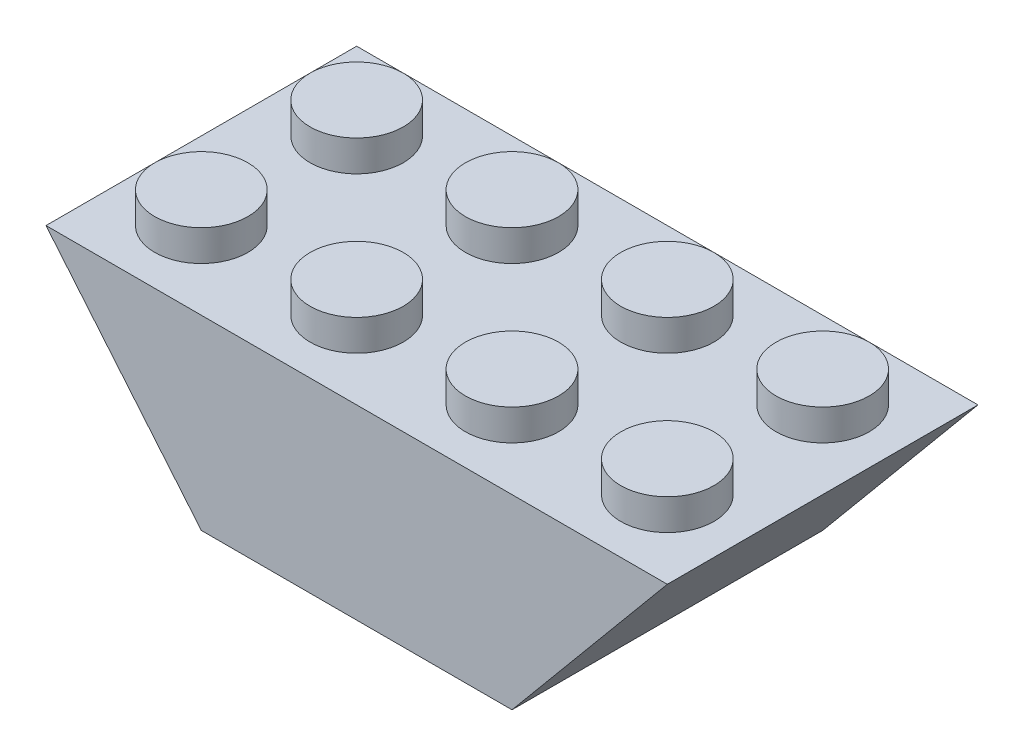
ISO-10303-21;
HEADER;
FILE_DESCRIPTION(('STEP AP214'),'2;1');
FILE_NAME('part.step','',(''),(''),'','','');
FILE_SCHEMA(('AUTOMOTIVE_DESIGN { 1 0 10303 214 1 1 1 1 }'));
ENDSEC;
DATA;
#1=APPLICATION_CONTEXT('core data for automotive mechanical design processes');
#2=APPLICATION_PROTOCOL_DEFINITION('international standard','automotive_design',2000,#1);
#3=PRODUCT_CONTEXT('',#1,'mechanical');
#4=PRODUCT('Part','Part','',(#3));
#5=PRODUCT_RELATED_PRODUCT_CATEGORY('part','',(#4));
#6=PRODUCT_DEFINITION_FORMATION('','',#4);
#7=PRODUCT_DEFINITION_CONTEXT('part definition',#1,'design');
#8=PRODUCT_DEFINITION('design','',#6,#7);
#9=PRODUCT_DEFINITION_SHAPE('','',#8);
#10=(LENGTH_UNIT() NAMED_UNIT(*) SI_UNIT(.MILLI.,.METRE.));
#11=(NAMED_UNIT(*) PLANE_ANGLE_UNIT() SI_UNIT($,.RADIAN.));
#12=(NAMED_UNIT(*) SI_UNIT($,.STERADIAN.) SOLID_ANGLE_UNIT());
#13=UNCERTAINTY_MEASURE_WITH_UNIT(LENGTH_MEASURE(1.E-05),#10,'distance_accuracy_value','');
#14=(GEOMETRIC_REPRESENTATION_CONTEXT(3) GLOBAL_UNCERTAINTY_ASSIGNED_CONTEXT((#13)) GLOBAL_UNIT_ASSIGNED_CONTEXT((#10,
#11,#12)) REPRESENTATION_CONTEXT('',''));
#15=CARTESIAN_POINT('',(0.,0.,0.));
#16=DIRECTION('',(0.,0.,1.));
#17=DIRECTION('',(1.,0.,0.));
#18=AXIS2_PLACEMENT_3D('',#15,#16,#17);
#19=CARTESIAN_POINT('',(-8.,0.,16.));
#20=DIRECTION('',(0.,1.,0.));
#21=DIRECTION('',(-1.,0.,0.));
#22=AXIS2_PLACEMENT_3D('',#19,#20,#21);
#23=PLANE('',#22);
#24=DIRECTION('',(1.,0.,0.));
#25=VECTOR('',#24,1.);
#26=CARTESIAN_POINT('',(-8.,0.,0.));
#27=LINE('',#26,#25);
#28=CARTESIAN_POINT('',(-8.,0.,0.));
#29=VERTEX_POINT('',#28);
#30=CARTESIAN_POINT('',(8.,0.,0.));
#31=VERTEX_POINT('',#30);
#32=EDGE_CURVE('E265',#29,#31,#27,.T.);
#33=ORIENTED_EDGE('',*,*,#32,.T.);
#34=DIRECTION('',(0.,0.,-1.));
#35=VECTOR('',#34,1.);
#36=CARTESIAN_POINT('',(8.,0.,16.));
#37=LINE('',#36,#35);
#38=CARTESIAN_POINT('',(8.,0.,16.));
#39=VERTEX_POINT('',#38);
#40=EDGE_CURVE('E278',#39,#31,#37,.T.);
#41=ORIENTED_EDGE('',*,*,#40,.F.);
#42=DIRECTION('',(1.,0.,0.));
#43=VECTOR('',#42,1.);
#44=CARTESIAN_POINT('',(-8.,0.,16.));
#45=LINE('',#44,#43);
#46=CARTESIAN_POINT('',(-8.,0.,16.));
#47=VERTEX_POINT('',#46);
#48=EDGE_CURVE('E93',#47,#39,#45,.T.);
#49=ORIENTED_EDGE('',*,*,#48,.F.);
#50=DIRECTION('',(0.,0.,-1.));
#51=VECTOR('',#50,1.);
#52=CARTESIAN_POINT('',(-8.,0.,16.));
#53=LINE('',#52,#51);
#54=EDGE_CURVE('E282',#47,#29,#53,.T.);
#55=ORIENTED_EDGE('',*,*,#54,.T.);
#56=EDGE_LOOP('',(#33,#41,#49,#55));
#57=FACE_BOUND('',#56,.T.);
#58=DIRECTION('',(1.,0.,0.));
#59=VECTOR('',#58,1.);
#60=CARTESIAN_POINT('',(-8.,0.,1.6));
#61=LINE('',#60,#59);
#62=CARTESIAN_POINT('',(-5.91726675309156,0.,1.6));
#63=VERTEX_POINT('',#62);
#64=CARTESIAN_POINT('',(5.91726675309156,0.,1.6));
#65=VERTEX_POINT('',#64);
#66=EDGE_CURVE('E169',#63,#65,#61,.T.);
#67=ORIENTED_EDGE('',*,*,#66,.F.);
#68=DIRECTION('',(0.,0.,-1.));
#69=VECTOR('',#68,1.);
#70=CARTESIAN_POINT('',(-5.91726675309156,0.,16.));
#71=LINE('',#70,#69);
#72=CARTESIAN_POINT('',(-5.91726675309156,0.,14.4));
#73=VERTEX_POINT('',#72);
#74=EDGE_CURVE('E167',#73,#63,#71,.T.);
#75=ORIENTED_EDGE('',*,*,#74,.F.);
#76=DIRECTION('',(1.,0.,0.));
#77=VECTOR('',#76,1.);
#78=CARTESIAN_POINT('',(-8.,0.,14.4));
#79=LINE('',#78,#77);
#80=CARTESIAN_POINT('',(5.91726675309156,0.,14.4));
#81=VERTEX_POINT('',#80);
#82=EDGE_CURVE('E184',#73,#81,#79,.T.);
#83=ORIENTED_EDGE('',*,*,#82,.T.);
#84=DIRECTION('',(0.,0.,-1.));
#85=VECTOR('',#84,1.);
#86=CARTESIAN_POINT('',(5.91726675309156,0.,16.));
#87=LINE('',#86,#85);
#88=EDGE_CURVE('E208',#81,#65,#87,.T.);
#89=ORIENTED_EDGE('',*,*,#88,.T.);
#90=EDGE_LOOP('',(#67,#75,#83,#89));
#91=FACE_BOUND('',#90,.T.);
#92=ADVANCED_FACE('F39',(#57,#91),#23,.F.);
#93=CARTESIAN_POINT('',(3.99999999999999,11.2,4.));
#94=DIRECTION('',(0.,1.,0.));
#95=DIRECTION('',(-1.,0.,0.));
#96=AXIS2_PLACEMENT_3D('',#93,#94,#95);
#97=PLANE('',#96);
#98=CARTESIAN_POINT('',(3.99999999999999,11.2,4.));
#99=DIRECTION('',(0.,1.,0.));
#100=DIRECTION('',(-1.,0.,0.));
#101=AXIS2_PLACEMENT_3D('',#98,#99,#100);
#102=CIRCLE('',#101,2.4);
#103=CARTESIAN_POINT('',(1.6,11.2,4.));
#104=VERTEX_POINT('',#103);
#105=EDGE_CURVE('E313',#104,#104,#102,.T.);
#106=ORIENTED_EDGE('',*,*,#105,.T.);
#107=EDGE_LOOP('',(#106));
#108=FACE_BOUND('',#107,.T.);
#109=ADVANCED_FACE('F41',(#108),#97,.T.);
#110=CARTESIAN_POINT('',(3.99999999999999,11.2,4.));
#111=DIRECTION('',(0.,-1.,0.));
#112=DIRECTION('',(1.,0.,0.));
#113=AXIS2_PLACEMENT_3D('',#110,#111,#112);
#114=CYLINDRICAL_SURFACE('',#113,2.4);
#115=ORIENTED_EDGE('',*,*,#105,.F.);
#116=EDGE_LOOP('',(#115));
#117=FACE_BOUND('',#116,.T.);
#118=CARTESIAN_POINT('',(3.99999999999999,9.6,4.));
#119=DIRECTION('',(0.,-1.,0.));
#120=DIRECTION('',(1.,0.,0.));
#121=AXIS2_PLACEMENT_3D('',#118,#119,#120);
#122=CIRCLE('',#121,2.4);
#123=CARTESIAN_POINT('',(6.39999999999999,9.6,4.));
#124=VERTEX_POINT('',#123);
#125=EDGE_CURVE('E309',#124,#124,#122,.F.);
#126=ORIENTED_EDGE('',*,*,#125,.T.);
#127=EDGE_LOOP('',(#126));
#128=FACE_BOUND('',#127,.T.);
#129=ADVANCED_FACE('F345',(#117,#128),#114,.T.);
#130=CARTESIAN_POINT('',(3.99999999999999,11.2,12.));
#131=DIRECTION('',(0.,1.,0.));
#132=DIRECTION('',(-1.,0.,0.));
#133=AXIS2_PLACEMENT_3D('',#130,#131,#132);
#134=PLANE('',#133);
#135=CARTESIAN_POINT('',(3.99999999999999,11.2,12.));
#136=DIRECTION('',(0.,1.,0.));
#137=DIRECTION('',(-1.,0.,0.));
#138=AXIS2_PLACEMENT_3D('',#135,#136,#137);
#139=CIRCLE('',#138,2.4);
#140=CARTESIAN_POINT('',(1.6,11.2,12.));
#141=VERTEX_POINT('',#140);
#142=EDGE_CURVE('E305',#141,#141,#139,.T.);
#143=ORIENTED_EDGE('',*,*,#142,.T.);
#144=EDGE_LOOP('',(#143));
#145=FACE_BOUND('',#144,.T.);
#146=ADVANCED_FACE('F347',(#145),#134,.T.);
#147=CARTESIAN_POINT('',(3.99999999999999,11.2,12.));
#148=DIRECTION('',(0.,-1.,0.));
#149=DIRECTION('',(1.,0.,0.));
#150=AXIS2_PLACEMENT_3D('',#147,#148,#149);
#151=CYLINDRICAL_SURFACE('',#150,2.4);
#152=ORIENTED_EDGE('',*,*,#142,.F.);
#153=EDGE_LOOP('',(#152));
#154=FACE_BOUND('',#153,.T.);
#155=CARTESIAN_POINT('',(3.99999999999999,9.6,12.));
#156=DIRECTION('',(0.,-1.,0.));
#157=DIRECTION('',(1.,0.,0.));
#158=AXIS2_PLACEMENT_3D('',#155,#156,#157);
#159=CIRCLE('',#158,2.4);
#160=CARTESIAN_POINT('',(6.39999999999999,9.6,12.));
#161=VERTEX_POINT('',#160);
#162=EDGE_CURVE('E301',#161,#161,#159,.F.);
#163=ORIENTED_EDGE('',*,*,#162,.T.);
#164=EDGE_LOOP('',(#163));
#165=FACE_BOUND('',#164,.T.);
#166=ADVANCED_FACE('F353',(#154,#165),#151,.T.);
#167=CARTESIAN_POINT('',(-4.00000000000001,11.2,4.));
#168=DIRECTION('',(0.,1.,0.));
#169=DIRECTION('',(-1.,0.,0.));
#170=AXIS2_PLACEMENT_3D('',#167,#168,#169);
#171=PLANE('',#170);
#172=CARTESIAN_POINT('',(-4.00000000000001,11.2,4.));
#173=DIRECTION('',(0.,1.,0.));
#174=DIRECTION('',(-1.,0.,0.));
#175=AXIS2_PLACEMENT_3D('',#172,#173,#174);
#176=CIRCLE('',#175,2.4);
#177=CARTESIAN_POINT('',(-6.4,11.2,4.));
#178=VERTEX_POINT('',#177);
#179=EDGE_CURVE('E297',#178,#178,#176,.T.);
#180=ORIENTED_EDGE('',*,*,#179,.T.);
#181=EDGE_LOOP('',(#180));
#182=FACE_BOUND('',#181,.T.);
#183=ADVANCED_FACE('F372',(#182),#171,.T.);
#184=CARTESIAN_POINT('',(-4.00000000000001,11.2,4.));
#185=DIRECTION('',(0.,-1.,0.));
#186=DIRECTION('',(1.,0.,0.));
#187=AXIS2_PLACEMENT_3D('',#184,#185,#186);
#188=CYLINDRICAL_SURFACE('',#187,2.4);
#189=ORIENTED_EDGE('',*,*,#179,.F.);
#190=EDGE_LOOP('',(#189));
#191=FACE_BOUND('',#190,.T.);
#192=CARTESIAN_POINT('',(-4.00000000000001,9.6,4.));
#193=DIRECTION('',(0.,-1.,0.));
#194=DIRECTION('',(1.,0.,0.));
#195=AXIS2_PLACEMENT_3D('',#192,#193,#194);
#196=CIRCLE('',#195,2.4);
#197=CARTESIAN_POINT('',(-1.60000000000001,9.6,4.));
#198=VERTEX_POINT('',#197);
#199=EDGE_CURVE('E293',#198,#198,#196,.F.);
#200=ORIENTED_EDGE('',*,*,#199,.T.);
#201=EDGE_LOOP('',(#200));
#202=FACE_BOUND('',#201,.T.);
#203=ADVANCED_FACE('F368',(#191,#202),#188,.T.);
#204=CARTESIAN_POINT('',(-16.,9.59999999999999,16.));
#205=DIRECTION('',(0.768221279597376,0.64018439966448,0.));
#206=DIRECTION('',(-0.64018439966448,0.768221279597376,0.));
#207=AXIS2_PLACEMENT_3D('',#204,#205,#206);
#208=PLANE('',#207);
#209=DIRECTION('',(0.64018439966448,-0.768221279597376,0.));
#210=VECTOR('',#209,1.);
#211=CARTESIAN_POINT('',(-16.,9.59999999999999,0.));
#212=LINE('',#211,#210);
#213=CARTESIAN_POINT('',(-16.,9.59999999999999,0.));
#214=VERTEX_POINT('',#213);
#215=EDGE_CURVE('E250',#214,#29,#212,.T.);
#216=ORIENTED_EDGE('',*,*,#215,.T.);
#217=ORIENTED_EDGE('',*,*,#54,.F.);
#218=DIRECTION('',(0.64018439966448,-0.768221279597376,0.));
#219=VECTOR('',#218,1.);
#220=CARTESIAN_POINT('',(-16.,9.59999999999999,16.));
#221=LINE('',#220,#219);
#222=CARTESIAN_POINT('',(-16.,9.59999999999999,16.));
#223=VERTEX_POINT('',#222);
#224=EDGE_CURVE('E251',#223,#47,#221,.T.);
#225=ORIENTED_EDGE('',*,*,#224,.F.);
#226=DIRECTION('',(0.,0.,-1.));
#227=VECTOR('',#226,1.);
#228=CARTESIAN_POINT('',(-16.,9.59999999999999,16.));
#229=LINE('',#228,#227);
#230=EDGE_CURVE('E261',#223,#214,#229,.T.);
#231=ORIENTED_EDGE('',*,*,#230,.T.);
#232=EDGE_LOOP('',(#216,#217,#225,#231));
#233=FACE_BOUND('',#232,.T.);
#234=ADVANCED_FACE('F365',(#233),#208,.F.);
#235=CARTESIAN_POINT('',(8.,0.,16.));
#236=DIRECTION('',(-0.768221279597376,0.64018439966448,0.));
#237=DIRECTION('',(-0.64018439966448,-0.768221279597376,0.));
#238=AXIS2_PLACEMENT_3D('',#235,#236,#237);
#239=PLANE('',#238);
#240=DIRECTION('',(0.64018439966448,0.768221279597376,0.));
#241=VECTOR('',#240,1.);
#242=CARTESIAN_POINT('',(8.,0.,0.));
#243=LINE('',#242,#241);
#244=CARTESIAN_POINT('',(16.,9.6,0.));
#245=VERTEX_POINT('',#244);
#246=EDGE_CURVE('E268',#31,#245,#243,.T.);
#247=ORIENTED_EDGE('',*,*,#246,.T.);
#248=DIRECTION('',(0.,0.,-1.));
#249=VECTOR('',#248,1.);
#250=CARTESIAN_POINT('',(16.,9.6,16.));
#251=LINE('',#250,#249);
#252=CARTESIAN_POINT('',(16.,9.6,16.));
#253=VERTEX_POINT('',#252);
#254=EDGE_CURVE('E275',#253,#245,#251,.T.);
#255=ORIENTED_EDGE('',*,*,#254,.F.);
#256=DIRECTION('',(0.64018439966448,0.768221279597376,0.));
#257=VECTOR('',#256,1.);
#258=CARTESIAN_POINT('',(8.,0.,16.));
#259=LINE('',#258,#257);
#260=EDGE_CURVE('E256',#39,#253,#259,.T.);
#261=ORIENTED_EDGE('',*,*,#260,.F.);
#262=ORIENTED_EDGE('',*,*,#40,.T.);
#263=EDGE_LOOP('',(#247,#255,#261,#262));
#264=FACE_BOUND('',#263,.T.);
#265=ADVANCED_FACE('F330',(#264),#239,.F.);
#266=CARTESIAN_POINT('',(16.,9.6,16.));
#267=DIRECTION('',(0.,-1.,0.));
#268=DIRECTION('',(1.,0.,0.));
#269=AXIS2_PLACEMENT_3D('',#266,#267,#268);
#270=PLANE('',#269);
#271=CARTESIAN_POINT('',(12.,9.6,4.));
#272=DIRECTION('',(0.,-1.,0.));
#273=DIRECTION('',(1.,0.,0.));
#274=AXIS2_PLACEMENT_3D('',#271,#272,#273);
#275=CIRCLE('',#274,2.4);
#276=CARTESIAN_POINT('',(14.4,9.6,4.));
#277=VERTEX_POINT('',#276);
#278=EDGE_CURVE('E11',#277,#277,#275,.F.);
#279=ORIENTED_EDGE('',*,*,#278,.F.);
#280=EDGE_LOOP('',(#279));
#281=FACE_BOUND('',#280,.T.);
#282=CARTESIAN_POINT('',(-12.,9.59999999999999,4.));
#283=DIRECTION('',(0.,-1.,0.));
#284=DIRECTION('',(1.,0.,0.));
#285=AXIS2_PLACEMENT_3D('',#282,#283,#284);
#286=CIRCLE('',#285,2.4);
#287=CARTESIAN_POINT('',(-9.60000000000001,9.59999999999999,4.));
#288=VERTEX_POINT('',#287);
#289=EDGE_CURVE('E48',#288,#288,#286,.F.);
#290=ORIENTED_EDGE('',*,*,#289,.F.);
#291=EDGE_LOOP('',(#290));
#292=FACE_BOUND('',#291,.T.);
#293=CARTESIAN_POINT('',(12.,9.6,12.));
#294=DIRECTION('',(0.,-1.,0.));
#295=DIRECTION('',(1.,0.,0.));
#296=AXIS2_PLACEMENT_3D('',#293,#294,#295);
#297=CIRCLE('',#296,2.4);
#298=CARTESIAN_POINT('',(14.4,9.6,12.));
#299=VERTEX_POINT('',#298);
#300=EDGE_CURVE('E317',#299,#299,#297,.F.);
#301=ORIENTED_EDGE('',*,*,#300,.F.);
#302=EDGE_LOOP('',(#301));
#303=FACE_BOUND('',#302,.T.);
#304=CARTESIAN_POINT('',(-4.00000000000001,9.6,12.));
#305=DIRECTION('',(0.,-1.,0.));
#306=DIRECTION('',(1.,0.,0.));
#307=AXIS2_PLACEMENT_3D('',#304,#305,#306);
#308=CIRCLE('',#307,2.4);
#309=CARTESIAN_POINT('',(-1.60000000000001,9.6,12.));
#310=VERTEX_POINT('',#309);
#311=EDGE_CURVE('E289',#310,#310,#308,.F.);
#312=ORIENTED_EDGE('',*,*,#311,.F.);
#313=EDGE_LOOP('',(#312));
#314=FACE_BOUND('',#313,.T.);
#315=CARTESIAN_POINT('',(-12.,9.59999999999999,12.));
#316=DIRECTION('',(0.,-1.,0.));
#317=DIRECTION('',(1.,0.,0.));
#318=AXIS2_PLACEMENT_3D('',#315,#316,#317);
#319=CIRCLE('',#318,2.4);
#320=CARTESIAN_POINT('',(-9.60000000000001,9.59999999999999,12.));
#321=VERTEX_POINT('',#320);
#322=EDGE_CURVE('E285',#321,#321,#319,.F.);
#323=ORIENTED_EDGE('',*,*,#322,.F.);
#324=EDGE_LOOP('',(#323));
#325=FACE_BOUND('',#324,.T.);
#326=DIRECTION('',(-1.,0.,0.));
#327=VECTOR('',#326,1.);
#328=CARTESIAN_POINT('',(16.,9.6,0.));
#329=LINE('',#328,#327);
#330=EDGE_CURVE('E85',#245,#214,#329,.T.);
#331=ORIENTED_EDGE('',*,*,#330,.T.);
#332=ORIENTED_EDGE('',*,*,#230,.F.);
#333=DIRECTION('',(-1.,0.,0.));
#334=VECTOR('',#333,1.);
#335=CARTESIAN_POINT('',(16.,9.6,16.));
#336=LINE('',#335,#334);
#337=EDGE_CURVE('E64',#253,#223,#336,.T.);
#338=ORIENTED_EDGE('',*,*,#337,.F.);
#339=ORIENTED_EDGE('',*,*,#254,.T.);
#340=EDGE_LOOP('',(#331,#332,#338,#339));
#341=FACE_BOUND('',#340,.T.);
#342=ORIENTED_EDGE('',*,*,#199,.F.);
#343=EDGE_LOOP('',(#342));
#344=FACE_BOUND('',#343,.T.);
#345=ORIENTED_EDGE('',*,*,#162,.F.);
#346=EDGE_LOOP('',(#345));
#347=FACE_BOUND('',#346,.T.);
#348=ORIENTED_EDGE('',*,*,#125,.F.);
#349=EDGE_LOOP('',(#348));
#350=FACE_BOUND('',#349,.T.);
#351=ADVANCED_FACE('F326',(#281,#292,#303,#314,#325,#341,#344,#347,#350),#270,.F.);
#352=CARTESIAN_POINT('',(0.,0.,16.));
#353=DIRECTION('',(0.,0.,1.));
#354=DIRECTION('',(1.,0.,0.));
#355=AXIS2_PLACEMENT_3D('',#352,#353,#354);
#356=PLANE('',#355);
#357=ORIENTED_EDGE('',*,*,#224,.T.);
#358=ORIENTED_EDGE('',*,*,#48,.T.);
#359=ORIENTED_EDGE('',*,*,#260,.T.);
#360=ORIENTED_EDGE('',*,*,#337,.T.);
#361=EDGE_LOOP('',(#357,#358,#359,#360));
#362=FACE_BOUND('',#361,.T.);
#363=ADVANCED_FACE('F329',(#362),#356,.T.);
#364=CARTESIAN_POINT('',(0.,0.,0.));
#365=DIRECTION('',(0.,0.,1.));
#366=DIRECTION('',(1.,0.,0.));
#367=AXIS2_PLACEMENT_3D('',#364,#365,#366);
#368=PLANE('',#367);
#369=ORIENTED_EDGE('',*,*,#215,.F.);
#370=ORIENTED_EDGE('',*,*,#330,.F.);
#371=ORIENTED_EDGE('',*,*,#246,.F.);
#372=ORIENTED_EDGE('',*,*,#32,.F.);
#373=EDGE_LOOP('',(#369,#370,#371,#372));
#374=FACE_BOUND('',#373,.T.);
#375=ADVANCED_FACE('F414',(#374),#368,.F.);
#376=CARTESIAN_POINT('',(-12.,11.2,12.));
#377=DIRECTION('',(0.,-1.,0.));
#378=DIRECTION('',(1.,0.,0.));
#379=AXIS2_PLACEMENT_3D('',#376,#377,#378);
#380=CYLINDRICAL_SURFACE('',#379,2.4);
#381=CARTESIAN_POINT('',(-12.,11.2,12.));
#382=DIRECTION('',(0.,1.,0.));
#383=DIRECTION('',(-1.,0.,0.));
#384=AXIS2_PLACEMENT_3D('',#381,#382,#383);
#385=CIRCLE('',#384,2.4);
#386=CARTESIAN_POINT('',(-14.4,11.2,12.));
#387=VERTEX_POINT('',#386);
#388=EDGE_CURVE('E246',#387,#387,#385,.T.);
#389=ORIENTED_EDGE('',*,*,#388,.F.);
#390=EDGE_LOOP('',(#389));
#391=FACE_BOUND('',#390,.T.);
#392=ORIENTED_EDGE('',*,*,#322,.T.);
#393=EDGE_LOOP('',(#392));
#394=FACE_BOUND('',#393,.T.);
#395=ADVANCED_FACE('F421',(#391,#394),#380,.T.);
#396=CARTESIAN_POINT('',(-12.,11.2,12.));
#397=DIRECTION('',(0.,1.,0.));
#398=DIRECTION('',(-1.,0.,0.));
#399=AXIS2_PLACEMENT_3D('',#396,#397,#398);
#400=PLANE('',#399);
#401=ORIENTED_EDGE('',*,*,#388,.T.);
#402=EDGE_LOOP('',(#401));
#403=FACE_BOUND('',#402,.T.);
#404=ADVANCED_FACE('F429',(#403),#400,.T.);
#405=CARTESIAN_POINT('',(-4.00000000000001,11.2,12.));
#406=DIRECTION('',(0.,-1.,0.));
#407=DIRECTION('',(1.,0.,0.));
#408=AXIS2_PLACEMENT_3D('',#405,#406,#407);
#409=CYLINDRICAL_SURFACE('',#408,2.4);
#410=CARTESIAN_POINT('',(-4.00000000000001,11.2,12.));
#411=DIRECTION('',(0.,1.,0.));
#412=DIRECTION('',(-1.,0.,0.));
#413=AXIS2_PLACEMENT_3D('',#410,#411,#412);
#414=CIRCLE('',#413,2.4);
#415=CARTESIAN_POINT('',(-6.4,11.2,12.));
#416=VERTEX_POINT('',#415);
#417=EDGE_CURVE('E242',#416,#416,#414,.T.);
#418=ORIENTED_EDGE('',*,*,#417,.F.);
#419=EDGE_LOOP('',(#418));
#420=FACE_BOUND('',#419,.T.);
#421=ORIENTED_EDGE('',*,*,#311,.T.);
#422=EDGE_LOOP('',(#421));
#423=FACE_BOUND('',#422,.T.);
#424=ADVANCED_FACE('F437',(#420,#423),#409,.T.);
#425=CARTESIAN_POINT('',(-4.00000000000001,11.2,12.));
#426=DIRECTION('',(0.,1.,0.));
#427=DIRECTION('',(-1.,0.,0.));
#428=AXIS2_PLACEMENT_3D('',#425,#426,#427);
#429=PLANE('',#428);
#430=ORIENTED_EDGE('',*,*,#417,.T.);
#431=EDGE_LOOP('',(#430));
#432=FACE_BOUND('',#431,.T.);
#433=ADVANCED_FACE('F445',(#432),#429,.T.);
#434=CARTESIAN_POINT('',(12.,11.2,12.));
#435=DIRECTION('',(0.,-1.,0.));
#436=DIRECTION('',(1.,0.,0.));
#437=AXIS2_PLACEMENT_3D('',#434,#435,#436);
#438=CYLINDRICAL_SURFACE('',#437,2.4);
#439=CARTESIAN_POINT('',(12.,11.2,12.));
#440=DIRECTION('',(0.,1.,0.));
#441=DIRECTION('',(-1.,0.,0.));
#442=AXIS2_PLACEMENT_3D('',#439,#440,#441);
#443=CIRCLE('',#442,2.4);
#444=CARTESIAN_POINT('',(9.6,11.2,12.));
#445=VERTEX_POINT('',#444);
#446=EDGE_CURVE('E238',#445,#445,#443,.T.);
#447=ORIENTED_EDGE('',*,*,#446,.F.);
#448=EDGE_LOOP('',(#447));
#449=FACE_BOUND('',#448,.T.);
#450=ORIENTED_EDGE('',*,*,#300,.T.);
#451=EDGE_LOOP('',(#450));
#452=FACE_BOUND('',#451,.T.);
#453=ADVANCED_FACE('F453',(#449,#452),#438,.T.);
#454=CARTESIAN_POINT('',(12.,11.2,12.));
#455=DIRECTION('',(0.,1.,0.));
#456=DIRECTION('',(-1.,0.,0.));
#457=AXIS2_PLACEMENT_3D('',#454,#455,#456);
#458=PLANE('',#457);
#459=ORIENTED_EDGE('',*,*,#446,.T.);
#460=EDGE_LOOP('',(#459));
#461=FACE_BOUND('',#460,.T.);
#462=ADVANCED_FACE('F461',(#461),#458,.T.);
#463=CARTESIAN_POINT('',(-12.,11.2,4.));
#464=DIRECTION('',(0.,-1.,0.));
#465=DIRECTION('',(1.,0.,0.));
#466=AXIS2_PLACEMENT_3D('',#463,#464,#465);
#467=CYLINDRICAL_SURFACE('',#466,2.4);
#468=CARTESIAN_POINT('',(-12.,11.2,4.));
#469=DIRECTION('',(0.,1.,0.));
#470=DIRECTION('',(-1.,0.,0.));
#471=AXIS2_PLACEMENT_3D('',#468,#469,#470);
#472=CIRCLE('',#471,2.4);
#473=CARTESIAN_POINT('',(-14.4,11.2,4.));
#474=VERTEX_POINT('',#473);
#475=EDGE_CURVE('E234',#474,#474,#472,.T.);
#476=ORIENTED_EDGE('',*,*,#475,.F.);
#477=EDGE_LOOP('',(#476));
#478=FACE_BOUND('',#477,.T.);
#479=ORIENTED_EDGE('',*,*,#289,.T.);
#480=EDGE_LOOP('',(#479));
#481=FACE_BOUND('',#480,.T.);
#482=ADVANCED_FACE('F324',(#478,#481),#467,.T.);
#483=CARTESIAN_POINT('',(-12.,11.2,4.));
#484=DIRECTION('',(0.,1.,0.));
#485=DIRECTION('',(-1.,0.,0.));
#486=AXIS2_PLACEMENT_3D('',#483,#484,#485);
#487=PLANE('',#486);
#488=ORIENTED_EDGE('',*,*,#475,.T.);
#489=EDGE_LOOP('',(#488));
#490=FACE_BOUND('',#489,.T.);
#491=ADVANCED_FACE('F476',(#490),#487,.T.);
#492=CARTESIAN_POINT('',(12.,11.2,4.));
#493=DIRECTION('',(0.,-1.,0.));
#494=DIRECTION('',(1.,0.,0.));
#495=AXIS2_PLACEMENT_3D('',#492,#493,#494);
#496=CYLINDRICAL_SURFACE('',#495,2.4);
#497=CARTESIAN_POINT('',(12.,11.2,4.));
#498=DIRECTION('',(0.,1.,0.));
#499=DIRECTION('',(-1.,0.,0.));
#500=AXIS2_PLACEMENT_3D('',#497,#498,#499);
#501=CIRCLE('',#500,2.4);
#502=CARTESIAN_POINT('',(9.6,11.2,4.));
#503=VERTEX_POINT('',#502);
#504=EDGE_CURVE('E230',#503,#503,#501,.T.);
#505=ORIENTED_EDGE('',*,*,#504,.F.);
#506=EDGE_LOOP('',(#505));
#507=FACE_BOUND('',#506,.T.);
#508=ORIENTED_EDGE('',*,*,#278,.T.);
#509=EDGE_LOOP('',(#508));
#510=FACE_BOUND('',#509,.T.);
#511=ADVANCED_FACE('F484',(#507,#510),#496,.T.);
#512=CARTESIAN_POINT('',(12.,11.2,4.));
#513=DIRECTION('',(0.,1.,0.));
#514=DIRECTION('',(-1.,0.,0.));
#515=AXIS2_PLACEMENT_3D('',#512,#513,#514);
#516=PLANE('',#515);
#517=ORIENTED_EDGE('',*,*,#504,.T.);
#518=EDGE_LOOP('',(#517));
#519=FACE_BOUND('',#518,.T.);
#520=ADVANCED_FACE('F492',(#519),#516,.T.);
#521=CARTESIAN_POINT('',(3.99999999999999,9.6,4.));
#522=DIRECTION('',(0.,1.,0.));
#523=DIRECTION('',(-1.,0.,0.));
#524=AXIS2_PLACEMENT_3D('',#521,#522,#523);
#525=PLANE('',#524);
#526=CARTESIAN_POINT('',(3.99999999999999,9.6,4.));
#527=DIRECTION('',(0.,1.,0.));
#528=DIRECTION('',(-1.,0.,0.));
#529=AXIS2_PLACEMENT_3D('',#526,#527,#528);
#530=CIRCLE('',#529,0.799999999999999);
#531=CARTESIAN_POINT('',(3.2,9.6,4.));
#532=VERTEX_POINT('',#531);
#533=EDGE_CURVE('E779',#532,#532,#530,.T.);
#534=ORIENTED_EDGE('',*,*,#533,.F.);
#535=EDGE_LOOP('',(#534));
#536=FACE_BOUND('',#535,.T.);
#537=ADVANCED_FACE('F500',(#536),#525,.F.);
#538=CARTESIAN_POINT('',(3.99999999999999,11.2,4.));
#539=DIRECTION('',(0.,-1.,0.));
#540=DIRECTION('',(1.,0.,0.));
#541=AXIS2_PLACEMENT_3D('',#538,#539,#540);
#542=CYLINDRICAL_SURFACE('',#541,0.799999999999999);
#543=ORIENTED_EDGE('',*,*,#533,.T.);
#544=EDGE_LOOP('',(#543));
#545=FACE_BOUND('',#544,.T.);
#546=CARTESIAN_POINT('',(4.,8.,4.));
#547=DIRECTION('',(0.,-1.,0.));
#548=DIRECTION('',(1.,0.,0.));
#549=AXIS2_PLACEMENT_3D('',#546,#547,#548);
#550=CIRCLE('',#549,0.799999999999999);
#551=CARTESIAN_POINT('',(4.79999999999999,8.,4.));
#552=VERTEX_POINT('',#551);
#553=EDGE_CURVE('E773',#552,#552,#550,.F.);
#554=ORIENTED_EDGE('',*,*,#553,.F.);
#555=EDGE_LOOP('',(#554));
#556=FACE_BOUND('',#555,.T.);
#557=ADVANCED_FACE('F508',(#545,#556),#542,.F.);
#558=CARTESIAN_POINT('',(3.99999999999999,9.6,12.));
#559=DIRECTION('',(0.,1.,0.));
#560=DIRECTION('',(-1.,0.,0.));
#561=AXIS2_PLACEMENT_3D('',#558,#559,#560);
#562=PLANE('',#561);
#563=CARTESIAN_POINT('',(3.99999999999999,9.6,12.));
#564=DIRECTION('',(0.,1.,0.));
#565=DIRECTION('',(-1.,0.,0.));
#566=AXIS2_PLACEMENT_3D('',#563,#564,#565);
#567=CIRCLE('',#566,0.799999999999999);
#568=CARTESIAN_POINT('',(3.2,9.6,12.));
#569=VERTEX_POINT('',#568);
#570=EDGE_CURVE('E801',#569,#569,#567,.T.);
#571=ORIENTED_EDGE('',*,*,#570,.F.);
#572=EDGE_LOOP('',(#571));
#573=FACE_BOUND('',#572,.T.);
#574=ADVANCED_FACE('F516',(#573),#562,.F.);
#575=CARTESIAN_POINT('',(3.99999999999999,11.2,12.));
#576=DIRECTION('',(0.,-1.,0.));
#577=DIRECTION('',(1.,0.,0.));
#578=AXIS2_PLACEMENT_3D('',#575,#576,#577);
#579=CYLINDRICAL_SURFACE('',#578,0.799999999999999);
#580=ORIENTED_EDGE('',*,*,#570,.T.);
#581=EDGE_LOOP('',(#580));
#582=FACE_BOUND('',#581,.T.);
#583=CARTESIAN_POINT('',(4.,8.,12.));
#584=DIRECTION('',(0.,-1.,0.));
#585=DIRECTION('',(1.,0.,0.));
#586=AXIS2_PLACEMENT_3D('',#583,#584,#585);
#587=CIRCLE('',#586,0.799999999999999);
#588=CARTESIAN_POINT('',(4.79999999999999,8.,12.));
#589=VERTEX_POINT('',#588);
#590=EDGE_CURVE('E798',#589,#589,#587,.F.);
#591=ORIENTED_EDGE('',*,*,#590,.F.);
#592=EDGE_LOOP('',(#591));
#593=FACE_BOUND('',#592,.T.);
#594=ADVANCED_FACE('F524',(#582,#593),#579,.F.);
#595=CARTESIAN_POINT('',(-4.00000000000001,9.6,4.));
#596=DIRECTION('',(0.,1.,0.));
#597=DIRECTION('',(-1.,0.,0.));
#598=AXIS2_PLACEMENT_3D('',#595,#596,#597);
#599=PLANE('',#598);
#600=CARTESIAN_POINT('',(-4.00000000000001,9.6,4.));
#601=DIRECTION('',(0.,1.,0.));
#602=DIRECTION('',(-1.,0.,0.));
#603=AXIS2_PLACEMENT_3D('',#600,#601,#602);
#604=CIRCLE('',#603,0.799999999999999);
#605=CARTESIAN_POINT('',(-4.8,9.6,4.));
#606=VERTEX_POINT('',#605);
#607=EDGE_CURVE('E180',#606,#606,#604,.T.);
#608=ORIENTED_EDGE('',*,*,#607,.F.);
#609=EDGE_LOOP('',(#608));
#610=FACE_BOUND('',#609,.T.);
#611=ADVANCED_FACE('F532',(#610),#599,.F.);
#612=CARTESIAN_POINT('',(-4.00000000000001,11.2,4.));
#613=DIRECTION('',(0.,-1.,0.));
#614=DIRECTION('',(1.,0.,0.));
#615=AXIS2_PLACEMENT_3D('',#612,#613,#614);
#616=CYLINDRICAL_SURFACE('',#615,0.799999999999999);
#617=ORIENTED_EDGE('',*,*,#607,.T.);
#618=EDGE_LOOP('',(#617));
#619=FACE_BOUND('',#618,.T.);
#620=CARTESIAN_POINT('',(-4.,7.99999999999999,4.));
#621=DIRECTION('',(0.,-1.,0.));
#622=DIRECTION('',(1.,0.,0.));
#623=AXIS2_PLACEMENT_3D('',#620,#621,#622);
#624=CIRCLE('',#623,0.799999999999999);
#625=CARTESIAN_POINT('',(-3.20000000000001,7.99999999999999,4.));
#626=VERTEX_POINT('',#625);
#627=EDGE_CURVE('E784',#626,#626,#624,.F.);
#628=ORIENTED_EDGE('',*,*,#627,.F.);
#629=EDGE_LOOP('',(#628));
#630=FACE_BOUND('',#629,.T.);
#631=ADVANCED_FACE('F540',(#619,#630),#616,.F.);
#632=CARTESIAN_POINT('',(-14.7708459526442,10.6242950394632,16.));
#633=DIRECTION('',(0.768221279597376,0.64018439966448,0.));
#634=DIRECTION('',(-0.64018439966448,0.768221279597376,0.));
#635=AXIS2_PLACEMENT_3D('',#632,#633,#634);
#636=PLANE('',#635);
#637=DIRECTION('',(0.64018439966448,-0.768221279597376,0.));
#638=VECTOR('',#637,1.);
#639=CARTESIAN_POINT('',(-14.7708459526442,10.6242950394632,1.6));
#640=LINE('',#639,#638);
#641=CARTESIAN_POINT('',(-12.5839334197582,7.99999999999999,1.6));
#642=VERTEX_POINT('',#641);
#643=EDGE_CURVE('E144',#642,#63,#640,.T.);
#644=ORIENTED_EDGE('',*,*,#643,.F.);
#645=DIRECTION('',(0.,0.,-1.));
#646=VECTOR('',#645,1.);
#647=CARTESIAN_POINT('',(-12.5839334197582,7.99999999999999,16.));
#648=LINE('',#647,#646);
#649=CARTESIAN_POINT('',(-12.5839334197582,7.99999999999999,3.45317117734206));
#650=VERTEX_POINT('',#649);
#651=EDGE_CURVE('E154',#650,#642,#648,.T.);
#652=ORIENTED_EDGE('',*,*,#651,.F.);
#653=CARTESIAN_POINT('',(-12.,7.29927989629013,4.));
#654=DIRECTION('',(0.768221279597376,0.64018439966448,0.));
#655=DIRECTION('',(0.64018439966448,-0.768221279597376,0.));
#656=AXIS2_PLACEMENT_3D('',#653,#654,#655);
#657=ELLIPSE('',#656,1.24963994814506,0.799999999999999);
#658=CARTESIAN_POINT('',(-12.5839334197582,7.99999999999999,4.54682882265794));
#659=VERTEX_POINT('',#658);
#660=EDGE_CURVE('E224',#650,#659,#657,.T.);
#661=ORIENTED_EDGE('',*,*,#660,.T.);
#662=CARTESIAN_POINT('',(-12.5839334197582,7.99999999999999,11.4531711773421));
#663=VERTEX_POINT('',#662);
#664=EDGE_CURVE('E162',#663,#659,#648,.T.);
#665=ORIENTED_EDGE('',*,*,#664,.F.);
#666=CARTESIAN_POINT('',(-12.,7.29927989629013,12.));
#667=DIRECTION('',(0.768221279597376,0.64018439966448,0.));
#668=DIRECTION('',(0.64018439966448,-0.768221279597376,0.));
#669=AXIS2_PLACEMENT_3D('',#666,#667,#668);
#670=ELLIPSE('',#669,1.24963994814506,0.799999999999999);
#671=CARTESIAN_POINT('',(-12.5839334197582,7.99999999999999,12.5468288226579));
#672=VERTEX_POINT('',#671);
#673=EDGE_CURVE('E217',#663,#672,#670,.T.);
#674=ORIENTED_EDGE('',*,*,#673,.T.);
#675=CARTESIAN_POINT('',(-12.5839334197582,7.99999999999999,14.4));
#676=VERTEX_POINT('',#675);
#677=EDGE_CURVE('E164',#676,#672,#648,.T.);
#678=ORIENTED_EDGE('',*,*,#677,.F.);
#679=DIRECTION('',(0.64018439966448,-0.768221279597376,0.));
#680=VECTOR('',#679,1.);
#681=CARTESIAN_POINT('',(-14.7708459526442,10.6242950394632,14.4));
#682=LINE('',#681,#680);
#683=EDGE_CURVE('E55',#676,#73,#682,.T.);
#684=ORIENTED_EDGE('',*,*,#683,.T.);
#685=ORIENTED_EDGE('',*,*,#74,.T.);
#686=EDGE_LOOP('',(#644,#652,#661,#665,#674,#678,#684,#685));
#687=FACE_BOUND('',#686,.T.);
#688=ADVANCED_FACE('F165',(#687),#636,.T.);
#689=CARTESIAN_POINT('',(6.7708459526442,1.02429503946317,16.));
#690=DIRECTION('',(-0.768221279597376,0.64018439966448,0.));
#691=DIRECTION('',(-0.64018439966448,-0.768221279597376,0.));
#692=AXIS2_PLACEMENT_3D('',#689,#690,#691);
#693=PLANE('',#692);
#694=DIRECTION('',(0.64018439966448,0.768221279597376,0.));
#695=VECTOR('',#694,1.);
#696=CARTESIAN_POINT('',(6.7708459526442,1.02429503946317,1.6));
#697=LINE('',#696,#695);
#698=CARTESIAN_POINT('',(12.5839334197582,8.,1.6));
#699=VERTEX_POINT('',#698);
#700=EDGE_CURVE('E147',#65,#699,#697,.T.);
#701=ORIENTED_EDGE('',*,*,#700,.F.);
#702=ORIENTED_EDGE('',*,*,#88,.F.);
#703=DIRECTION('',(0.64018439966448,0.768221279597376,0.));
#704=VECTOR('',#703,1.);
#705=CARTESIAN_POINT('',(6.7708459526442,1.02429503946317,14.4));
#706=LINE('',#705,#704);
#707=CARTESIAN_POINT('',(12.5839334197582,8.,14.4));
#708=VERTEX_POINT('',#707);
#709=EDGE_CURVE('E185',#81,#708,#706,.T.);
#710=ORIENTED_EDGE('',*,*,#709,.T.);
#711=DIRECTION('',(0.,0.,-1.));
#712=VECTOR('',#711,1.);
#713=CARTESIAN_POINT('',(12.5839334197582,8.,16.));
#714=LINE('',#713,#712);
#715=CARTESIAN_POINT('',(12.5839334197582,8.,12.5468288226579));
#716=VERTEX_POINT('',#715);
#717=EDGE_CURVE('E213',#708,#716,#714,.T.);
#718=ORIENTED_EDGE('',*,*,#717,.T.);
#719=CARTESIAN_POINT('',(12.,7.29927989629013,12.));
#720=DIRECTION('',(-0.768221279597376,0.64018439966448,0.));
#721=DIRECTION('',(-0.64018439966448,-0.768221279597376,0.));
#722=AXIS2_PLACEMENT_3D('',#719,#720,#721);
#723=ELLIPSE('',#722,1.24963994814506,0.799999999999999);
#724=CARTESIAN_POINT('',(12.5839334197582,8.,11.4531711773421));
#725=VERTEX_POINT('',#724);
#726=EDGE_CURVE('E220',#725,#716,#723,.F.);
#727=ORIENTED_EDGE('',*,*,#726,.F.);
#728=CARTESIAN_POINT('',(12.5839334197582,8.,4.54682882265794));
#729=VERTEX_POINT('',#728);
#730=EDGE_CURVE('E794',#725,#729,#714,.T.);
#731=ORIENTED_EDGE('',*,*,#730,.T.);
#732=CARTESIAN_POINT('',(12.,7.29927989629013,4.));
#733=DIRECTION('',(-0.768221279597376,0.64018439966448,0.));
#734=DIRECTION('',(-0.64018439966448,-0.768221279597376,0.));
#735=AXIS2_PLACEMENT_3D('',#732,#733,#734);
#736=ELLIPSE('',#735,1.24963994814506,0.799999999999999);
#737=CARTESIAN_POINT('',(12.5839334197582,8.,3.45317117734207));
#738=VERTEX_POINT('',#737);
#739=EDGE_CURVE('E227',#738,#729,#736,.F.);
#740=ORIENTED_EDGE('',*,*,#739,.F.);
#741=EDGE_CURVE('E161',#738,#699,#714,.T.);
#742=ORIENTED_EDGE('',*,*,#741,.T.);
#743=EDGE_LOOP('',(#701,#702,#710,#718,#727,#731,#740,#742));
#744=FACE_BOUND('',#743,.T.);
#745=ADVANCED_FACE('F555',(#744),#693,.T.);
#746=CARTESIAN_POINT('',(16.,8.,16.));
#747=DIRECTION('',(0.,-1.,0.));
#748=DIRECTION('',(1.,0.,0.));
#749=AXIS2_PLACEMENT_3D('',#746,#747,#748);
#750=PLANE('',#749);
#751=CARTESIAN_POINT('',(-4.,7.99999999999999,12.));
#752=DIRECTION('',(0.,-1.,0.));
#753=DIRECTION('',(1.,0.,0.));
#754=AXIS2_PLACEMENT_3D('',#751,#752,#753);
#755=CIRCLE('',#754,0.799999999999999);
#756=CARTESIAN_POINT('',(-3.20000000000001,7.99999999999999,12.));
#757=VERTEX_POINT('',#756);
#758=EDGE_CURVE('E780',#757,#757,#755,.F.);
#759=ORIENTED_EDGE('',*,*,#758,.T.);
#760=EDGE_LOOP('',(#759));
#761=FACE_BOUND('',#760,.T.);
#762=ORIENTED_EDGE('',*,*,#664,.T.);
#763=CARTESIAN_POINT('',(-12.,7.99999999999999,4.));
#764=DIRECTION('',(0.,-1.,0.));
#765=DIRECTION('',(1.,0.,0.));
#766=AXIS2_PLACEMENT_3D('',#763,#764,#765);
#767=CIRCLE('',#766,0.799999999999999);
#768=EDGE_CURVE('E159',#659,#650,#767,.F.);
#769=ORIENTED_EDGE('',*,*,#768,.T.);
#770=ORIENTED_EDGE('',*,*,#651,.T.);
#771=DIRECTION('',(-1.,0.,0.));
#772=VECTOR('',#771,1.);
#773=CARTESIAN_POINT('',(16.,8.,1.6));
#774=LINE('',#773,#772);
#775=EDGE_CURVE('E140',#699,#642,#774,.T.);
#776=ORIENTED_EDGE('',*,*,#775,.F.);
#777=ORIENTED_EDGE('',*,*,#741,.F.);
#778=CARTESIAN_POINT('',(12.,8.,4.));
#779=DIRECTION('',(0.,-1.,0.));
#780=DIRECTION('',(1.,0.,0.));
#781=AXIS2_PLACEMENT_3D('',#778,#779,#780);
#782=CIRCLE('',#781,0.799999999999999);
#783=EDGE_CURVE('E221',#738,#729,#782,.F.);
#784=ORIENTED_EDGE('',*,*,#783,.T.);
#785=ORIENTED_EDGE('',*,*,#730,.F.);
#786=CARTESIAN_POINT('',(12.,8.,12.));
#787=DIRECTION('',(0.,-1.,0.));
#788=DIRECTION('',(1.,0.,0.));
#789=AXIS2_PLACEMENT_3D('',#786,#787,#788);
#790=CIRCLE('',#789,0.799999999999999);
#791=EDGE_CURVE('E770',#725,#716,#790,.F.);
#792=ORIENTED_EDGE('',*,*,#791,.T.);
#793=ORIENTED_EDGE('',*,*,#717,.F.);
#794=DIRECTION('',(-1.,0.,0.));
#795=VECTOR('',#794,1.);
#796=CARTESIAN_POINT('',(16.,8.,14.4));
#797=LINE('',#796,#795);
#798=EDGE_CURVE('E188',#708,#676,#797,.T.);
#799=ORIENTED_EDGE('',*,*,#798,.T.);
#800=ORIENTED_EDGE('',*,*,#677,.T.);
#801=CARTESIAN_POINT('',(-12.,7.99999999999999,12.));
#802=DIRECTION('',(0.,-1.,0.));
#803=DIRECTION('',(1.,0.,0.));
#804=AXIS2_PLACEMENT_3D('',#801,#802,#803);
#805=CIRCLE('',#804,0.799999999999999);
#806=EDGE_CURVE('E207',#672,#663,#805,.F.);
#807=ORIENTED_EDGE('',*,*,#806,.T.);
#808=EDGE_LOOP('',(#762,#769,#770,#776,#777,#784,#785,#792,#793,#799,#800,#807));
#809=FACE_BOUND('',#808,.T.);
#810=ORIENTED_EDGE('',*,*,#627,.T.);
#811=EDGE_LOOP('',(#810));
#812=FACE_BOUND('',#811,.T.);
#813=ORIENTED_EDGE('',*,*,#590,.T.);
#814=EDGE_LOOP('',(#813));
#815=FACE_BOUND('',#814,.T.);
#816=ORIENTED_EDGE('',*,*,#553,.T.);
#817=EDGE_LOOP('',(#816));
#818=FACE_BOUND('',#817,.T.);
#819=ADVANCED_FACE('F156',(#761,#809,#812,#815,#818),#750,.T.);
#820=CARTESIAN_POINT('',(0.,0.,14.4));
#821=DIRECTION('',(0.,0.,1.));
#822=DIRECTION('',(1.,0.,0.));
#823=AXIS2_PLACEMENT_3D('',#820,#821,#822);
#824=PLANE('',#823);
#825=ORIENTED_EDGE('',*,*,#683,.F.);
#826=ORIENTED_EDGE('',*,*,#798,.F.);
#827=ORIENTED_EDGE('',*,*,#709,.F.);
#828=ORIENTED_EDGE('',*,*,#82,.F.);
#829=EDGE_LOOP('',(#825,#826,#827,#828));
#830=FACE_BOUND('',#829,.T.);
#831=ADVANCED_FACE('F569',(#830),#824,.F.);
#832=CARTESIAN_POINT('',(0.,0.,1.6));
#833=DIRECTION('',(0.,0.,1.));
#834=DIRECTION('',(1.,0.,0.));
#835=AXIS2_PLACEMENT_3D('',#832,#833,#834);
#836=PLANE('',#835);
#837=ORIENTED_EDGE('',*,*,#643,.T.);
#838=ORIENTED_EDGE('',*,*,#66,.T.);
#839=ORIENTED_EDGE('',*,*,#700,.T.);
#840=ORIENTED_EDGE('',*,*,#775,.T.);
#841=EDGE_LOOP('',(#837,#838,#839,#840));
#842=FACE_BOUND('',#841,.T.);
#843=ADVANCED_FACE('F142',(#842),#836,.T.);
#844=CARTESIAN_POINT('',(-12.,11.2,12.));
#845=DIRECTION('',(0.,-1.,0.));
#846=DIRECTION('',(1.,0.,0.));
#847=AXIS2_PLACEMENT_3D('',#844,#845,#846);
#848=CYLINDRICAL_SURFACE('',#847,0.799999999999999);
#849=CARTESIAN_POINT('',(-12.,9.6,12.));
#850=DIRECTION('',(0.,1.,0.));
#851=DIRECTION('',(-1.,0.,0.));
#852=AXIS2_PLACEMENT_3D('',#849,#850,#851);
#853=CIRCLE('',#852,0.799999999999999);
#854=CARTESIAN_POINT('',(-12.8,9.6,12.));
#855=VERTEX_POINT('',#854);
#856=EDGE_CURVE('E170',#855,#855,#853,.T.);
#857=ORIENTED_EDGE('',*,*,#856,.T.);
#858=EDGE_LOOP('',(#857));
#859=FACE_BOUND('',#858,.T.);
#860=ORIENTED_EDGE('',*,*,#806,.F.);
#861=ORIENTED_EDGE('',*,*,#673,.F.);
#862=EDGE_LOOP('',(#860,#861));
#863=FACE_BOUND('',#862,.T.);
#864=ADVANCED_FACE('F584',(#859,#863),#848,.F.);
#865=CARTESIAN_POINT('',(-12.,9.6,12.));
#866=DIRECTION('',(0.,1.,0.));
#867=DIRECTION('',(-1.,0.,0.));
#868=AXIS2_PLACEMENT_3D('',#865,#866,#867);
#869=PLANE('',#868);
#870=ORIENTED_EDGE('',*,*,#856,.F.);
#871=EDGE_LOOP('',(#870));
#872=FACE_BOUND('',#871,.T.);
#873=ADVANCED_FACE('F591',(#872),#869,.F.);
#874=CARTESIAN_POINT('',(-4.00000000000001,11.2,12.));
#875=DIRECTION('',(0.,-1.,0.));
#876=DIRECTION('',(1.,0.,0.));
#877=AXIS2_PLACEMENT_3D('',#874,#875,#876);
#878=CYLINDRICAL_SURFACE('',#877,0.799999999999999);
#879=CARTESIAN_POINT('',(-4.00000000000001,9.6,12.));
#880=DIRECTION('',(0.,1.,0.));
#881=DIRECTION('',(-1.,0.,0.));
#882=AXIS2_PLACEMENT_3D('',#879,#880,#881);
#883=CIRCLE('',#882,0.799999999999999);
#884=CARTESIAN_POINT('',(-4.8,9.6,12.));
#885=VERTEX_POINT('',#884);
#886=EDGE_CURVE('E176',#885,#885,#883,.T.);
#887=ORIENTED_EDGE('',*,*,#886,.T.);
#888=EDGE_LOOP('',(#887));
#889=FACE_BOUND('',#888,.T.);
#890=ORIENTED_EDGE('',*,*,#758,.F.);
#891=EDGE_LOOP('',(#890));
#892=FACE_BOUND('',#891,.T.);
#893=ADVANCED_FACE('F599',(#889,#892),#878,.F.);
#894=CARTESIAN_POINT('',(-4.00000000000001,9.6,12.));
#895=DIRECTION('',(0.,1.,0.));
#896=DIRECTION('',(-1.,0.,0.));
#897=AXIS2_PLACEMENT_3D('',#894,#895,#896);
#898=PLANE('',#897);
#899=ORIENTED_EDGE('',*,*,#886,.F.);
#900=EDGE_LOOP('',(#899));
#901=FACE_BOUND('',#900,.T.);
#902=ADVANCED_FACE('F607',(#901),#898,.F.);
#903=CARTESIAN_POINT('',(12.,11.2,12.));
#904=DIRECTION('',(0.,-1.,0.));
#905=DIRECTION('',(1.,0.,0.));
#906=AXIS2_PLACEMENT_3D('',#903,#904,#905);
#907=CYLINDRICAL_SURFACE('',#906,0.799999999999999);
#908=CARTESIAN_POINT('',(12.,9.6,12.));
#909=DIRECTION('',(0.,1.,0.));
#910=DIRECTION('',(-1.,0.,0.));
#911=AXIS2_PLACEMENT_3D('',#908,#909,#910);
#912=CIRCLE('',#911,0.799999999999999);
#913=CARTESIAN_POINT('',(11.2,9.6,12.));
#914=VERTEX_POINT('',#913);
#915=EDGE_CURVE('E194',#914,#914,#912,.T.);
#916=ORIENTED_EDGE('',*,*,#915,.T.);
#917=EDGE_LOOP('',(#916));
#918=FACE_BOUND('',#917,.T.);
#919=ORIENTED_EDGE('',*,*,#791,.F.);
#920=ORIENTED_EDGE('',*,*,#726,.T.);
#921=EDGE_LOOP('',(#919,#920));
#922=FACE_BOUND('',#921,.T.);
#923=ADVANCED_FACE('F615',(#918,#922),#907,.F.);
#924=CARTESIAN_POINT('',(12.,9.6,12.));
#925=DIRECTION('',(0.,1.,0.));
#926=DIRECTION('',(-1.,0.,0.));
#927=AXIS2_PLACEMENT_3D('',#924,#925,#926);
#928=PLANE('',#927);
#929=ORIENTED_EDGE('',*,*,#915,.F.);
#930=EDGE_LOOP('',(#929));
#931=FACE_BOUND('',#930,.T.);
#932=ADVANCED_FACE('F623',(#931),#928,.F.);
#933=CARTESIAN_POINT('',(-12.,11.2,4.));
#934=DIRECTION('',(0.,-1.,0.));
#935=DIRECTION('',(1.,0.,0.));
#936=AXIS2_PLACEMENT_3D('',#933,#934,#935);
#937=CYLINDRICAL_SURFACE('',#936,0.799999999999999);
#938=CARTESIAN_POINT('',(-12.,9.6,4.));
#939=DIRECTION('',(0.,1.,0.));
#940=DIRECTION('',(-1.,0.,0.));
#941=AXIS2_PLACEMENT_3D('',#938,#939,#940);
#942=CIRCLE('',#941,0.799999999999999);
#943=CARTESIAN_POINT('',(-12.8,9.6,4.));
#944=VERTEX_POINT('',#943);
#945=EDGE_CURVE('E198',#944,#944,#942,.T.);
#946=ORIENTED_EDGE('',*,*,#945,.T.);
#947=EDGE_LOOP('',(#946));
#948=FACE_BOUND('',#947,.T.);
#949=ORIENTED_EDGE('',*,*,#768,.F.);
#950=ORIENTED_EDGE('',*,*,#660,.F.);
#951=EDGE_LOOP('',(#949,#950));
#952=FACE_BOUND('',#951,.T.);
#953=ADVANCED_FACE('F631',(#948,#952),#937,.F.);
#954=CARTESIAN_POINT('',(-12.,9.6,4.));
#955=DIRECTION('',(0.,1.,0.));
#956=DIRECTION('',(-1.,0.,0.));
#957=AXIS2_PLACEMENT_3D('',#954,#955,#956);
#958=PLANE('',#957);
#959=ORIENTED_EDGE('',*,*,#945,.F.);
#960=EDGE_LOOP('',(#959));
#961=FACE_BOUND('',#960,.T.);
#962=ADVANCED_FACE('F639',(#961),#958,.F.);
#963=CARTESIAN_POINT('',(12.,11.2,4.));
#964=DIRECTION('',(0.,-1.,0.));
#965=DIRECTION('',(1.,0.,0.));
#966=AXIS2_PLACEMENT_3D('',#963,#964,#965);
#967=CYLINDRICAL_SURFACE('',#966,0.799999999999999);
#968=CARTESIAN_POINT('',(12.,9.6,4.));
#969=DIRECTION('',(0.,1.,0.));
#970=DIRECTION('',(-1.,0.,0.));
#971=AXIS2_PLACEMENT_3D('',#968,#969,#970);
#972=CIRCLE('',#971,0.799999999999999);
#973=CARTESIAN_POINT('',(11.2,9.6,4.));
#974=VERTEX_POINT('',#973);
#975=EDGE_CURVE('E202',#974,#974,#972,.T.);
#976=ORIENTED_EDGE('',*,*,#975,.T.);
#977=EDGE_LOOP('',(#976));
#978=FACE_BOUND('',#977,.T.);
#979=ORIENTED_EDGE('',*,*,#783,.F.);
#980=ORIENTED_EDGE('',*,*,#739,.T.);
#981=EDGE_LOOP('',(#979,#980));
#982=FACE_BOUND('',#981,.T.);
#983=ADVANCED_FACE('F647',(#978,#982),#967,.F.);
#984=CARTESIAN_POINT('',(12.,9.6,4.));
#985=DIRECTION('',(0.,1.,0.));
#986=DIRECTION('',(-1.,0.,0.));
#987=AXIS2_PLACEMENT_3D('',#984,#985,#986);
#988=PLANE('',#987);
#989=ORIENTED_EDGE('',*,*,#975,.F.);
#990=EDGE_LOOP('',(#989));
#991=FACE_BOUND('',#990,.T.);
#992=ADVANCED_FACE('F655',(#991),#988,.F.);
#993=CLOSED_SHELL('',(#92,#109,#129,#146,#166,#183,#203,#234,#265,#351,#363,#375,#395,#404,#424,
#433,#453,#462,#482,#491,#511,#520,#537,#557,#574,#594,#611,#631,#688,#745,#819,#831,#843,#864,
#873,#893,#902,#923,#932,#953,#962,#983,#992));
#994=MANIFOLD_SOLID_BREP('B2',#993);
#995=ADVANCED_BREP_SHAPE_REPRESENTATION('',(#18,#994),#14);
#996=SHAPE_DEFINITION_REPRESENTATION(#9,#995);
ENDSEC;
END-ISO-10303-21;
